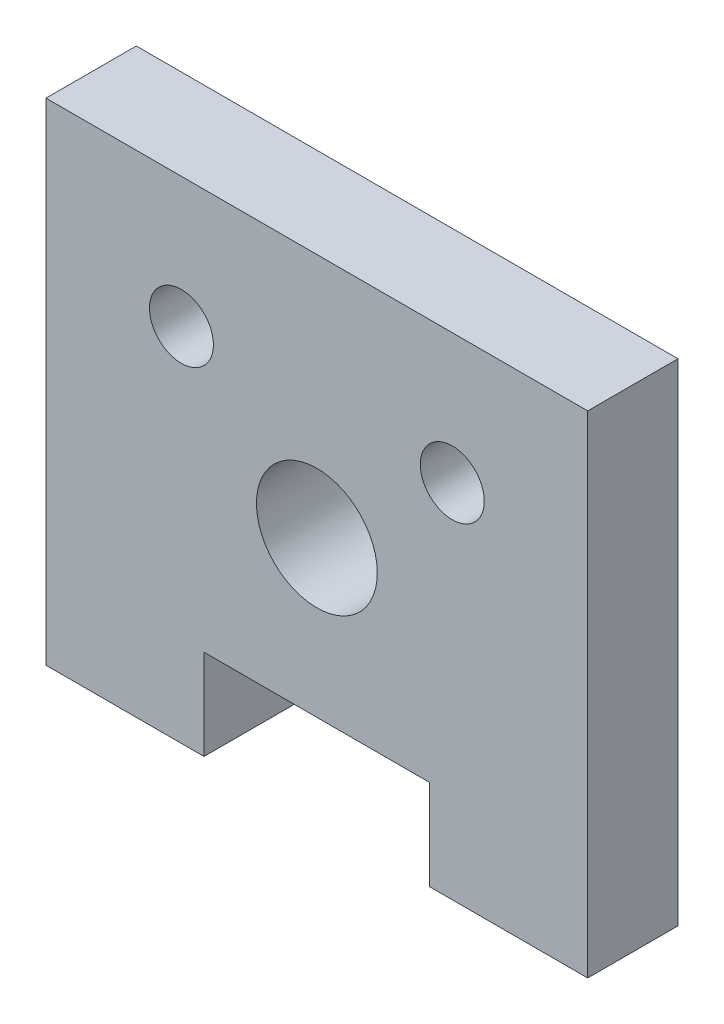
ISO-10303-21;
HEADER;
FILE_DESCRIPTION(('STEP AP214'),'2;1');
FILE_NAME('part.step','',(''),(''),'','','');
FILE_SCHEMA(('AUTOMOTIVE_DESIGN { 1 0 10303 214 1 1 1 1 }'));
ENDSEC;
DATA;
#1=APPLICATION_CONTEXT('core data for automotive mechanical design processes');
#2=APPLICATION_PROTOCOL_DEFINITION('international standard','automotive_design',2000,#1);
#3=PRODUCT_CONTEXT('',#1,'mechanical');
#4=PRODUCT('Part','Part','',(#3));
#5=PRODUCT_RELATED_PRODUCT_CATEGORY('part','',(#4));
#6=PRODUCT_DEFINITION_FORMATION('','',#4);
#7=PRODUCT_DEFINITION_CONTEXT('part definition',#1,'design');
#8=PRODUCT_DEFINITION('design','',#6,#7);
#9=PRODUCT_DEFINITION_SHAPE('','',#8);
#10=(LENGTH_UNIT() NAMED_UNIT(*) SI_UNIT(.MILLI.,.METRE.));
#11=(NAMED_UNIT(*) PLANE_ANGLE_UNIT() SI_UNIT($,.RADIAN.));
#12=(NAMED_UNIT(*) SI_UNIT($,.STERADIAN.) SOLID_ANGLE_UNIT());
#13=UNCERTAINTY_MEASURE_WITH_UNIT(LENGTH_MEASURE(1.E-05),#10,'distance_accuracy_value','');
#14=(GEOMETRIC_REPRESENTATION_CONTEXT(3) GLOBAL_UNCERTAINTY_ASSIGNED_CONTEXT((#13)) GLOBAL_UNIT_ASSIGNED_CONTEXT((#10,
#11,#12)) REPRESENTATION_CONTEXT('',''));
#15=CARTESIAN_POINT('',(0.,0.,0.));
#16=DIRECTION('',(0.,0.,1.));
#17=DIRECTION('',(1.,0.,0.));
#18=AXIS2_PLACEMENT_3D('',#15,#16,#17);
#19=CARTESIAN_POINT('',(0.,0.,12.7));
#20=DIRECTION('',(0.,0.,1.));
#21=DIRECTION('',(1.,0.,0.));
#22=AXIS2_PLACEMENT_3D('',#19,#20,#21);
#23=PLANE('',#22);
#24=CARTESIAN_POINT('',(19.05,16.256,12.7));
#25=DIRECTION('',(0.,0.,1.));
#26=DIRECTION('',(1.,0.,0.));
#27=AXIS2_PLACEMENT_3D('',#24,#25,#26);
#28=CIRCLE('',#27,4.5);
#29=CARTESIAN_POINT('',(23.55,16.256,12.7));
#30=VERTEX_POINT('',#29);
#31=EDGE_CURVE('E182',#30,#30,#28,.T.);
#32=ORIENTED_EDGE('',*,*,#31,.F.);
#33=EDGE_LOOP('',(#32));
#34=FACE_BOUND('',#33,.T.);
#35=DIRECTION('',(0.,-1.,0.));
#36=VECTOR('',#35,1.);
#37=CARTESIAN_POINT('',(-38.1,-34.544,12.7));
#38=LINE('',#37,#36);
#39=CARTESIAN_POINT('',(-38.1,34.544,12.7));
#40=VERTEX_POINT('',#39);
#41=CARTESIAN_POINT('',(-38.1,-34.544,12.7));
#42=VERTEX_POINT('',#41);
#43=EDGE_CURVE('E145',#40,#42,#38,.T.);
#44=ORIENTED_EDGE('',*,*,#43,.T.);
#45=DIRECTION('',(1.,0.,0.));
#46=VECTOR('',#45,1.);
#47=CARTESIAN_POINT('',(-15.875,-34.544,12.7));
#48=LINE('',#47,#46);
#49=CARTESIAN_POINT('',(-15.875,-34.544,12.7));
#50=VERTEX_POINT('',#49);
#51=EDGE_CURVE('E93',#42,#50,#48,.T.);
#52=ORIENTED_EDGE('',*,*,#51,.T.);
#53=DIRECTION('',(0.,1.,0.));
#54=VECTOR('',#53,1.);
#55=CARTESIAN_POINT('',(-15.875,-34.544,12.7));
#56=LINE('',#55,#54);
#57=CARTESIAN_POINT('',(-15.875,-21.844,12.7));
#58=VERTEX_POINT('',#57);
#59=EDGE_CURVE('E160',#50,#58,#56,.T.);
#60=ORIENTED_EDGE('',*,*,#59,.T.);
#61=DIRECTION('',(1.,0.,0.));
#62=VECTOR('',#61,1.);
#63=CARTESIAN_POINT('',(-15.875,-21.844,12.7));
#64=LINE('',#63,#62);
#65=CARTESIAN_POINT('',(15.875,-21.844,12.7));
#66=VERTEX_POINT('',#65);
#67=EDGE_CURVE('E173',#58,#66,#64,.T.);
#68=ORIENTED_EDGE('',*,*,#67,.T.);
#69=DIRECTION('',(0.,-1.,0.));
#70=VECTOR('',#69,1.);
#71=CARTESIAN_POINT('',(15.875,-21.844,12.7));
#72=LINE('',#71,#70);
#73=CARTESIAN_POINT('',(15.875,-34.544,12.7));
#74=VERTEX_POINT('',#73);
#75=EDGE_CURVE('E112',#66,#74,#72,.T.);
#76=ORIENTED_EDGE('',*,*,#75,.T.);
#77=DIRECTION('',(1.,0.,0.));
#78=VECTOR('',#77,1.);
#79=CARTESIAN_POINT('',(38.1,-34.544,12.7));
#80=LINE('',#79,#78);
#81=CARTESIAN_POINT('',(38.1,-34.544,12.7));
#82=VERTEX_POINT('',#81);
#83=EDGE_CURVE('E106',#74,#82,#80,.T.);
#84=ORIENTED_EDGE('',*,*,#83,.T.);
#85=DIRECTION('',(0.,1.,0.));
#86=VECTOR('',#85,1.);
#87=CARTESIAN_POINT('',(38.1,-34.544,12.7));
#88=LINE('',#87,#86);
#89=CARTESIAN_POINT('',(38.1,34.544,12.7));
#90=VERTEX_POINT('',#89);
#91=EDGE_CURVE('E110',#82,#90,#88,.T.);
#92=ORIENTED_EDGE('',*,*,#91,.T.);
#93=DIRECTION('',(-1.,0.,0.));
#94=VECTOR('',#93,1.);
#95=CARTESIAN_POINT('',(38.1,34.544,12.7));
#96=LINE('',#95,#94);
#97=EDGE_CURVE('E50',#90,#40,#96,.T.);
#98=ORIENTED_EDGE('',*,*,#97,.T.);
#99=EDGE_LOOP('',(#44,#52,#60,#68,#76,#84,#92,#98));
#100=FACE_BOUND('',#99,.T.);
#101=CARTESIAN_POINT('',(0.,0.,12.7));
#102=DIRECTION('',(0.,0.,1.));
#103=DIRECTION('',(1.,0.,0.));
#104=AXIS2_PLACEMENT_3D('',#101,#102,#103);
#105=CIRCLE('',#104,8.5);
#106=CARTESIAN_POINT('',(8.5,0.,12.7));
#107=VERTEX_POINT('',#106);
#108=EDGE_CURVE('E134',#107,#107,#105,.T.);
#109=ORIENTED_EDGE('',*,*,#108,.F.);
#110=EDGE_LOOP('',(#109));
#111=FACE_BOUND('',#110,.T.);
#112=CARTESIAN_POINT('',(-19.05,16.256,12.7));
#113=DIRECTION('',(0.,0.,1.));
#114=DIRECTION('',(1.,0.,0.));
#115=AXIS2_PLACEMENT_3D('',#112,#113,#114);
#116=CIRCLE('',#115,4.5);
#117=CARTESIAN_POINT('',(-14.55,16.256,12.7));
#118=VERTEX_POINT('',#117);
#119=EDGE_CURVE('E188',#118,#118,#116,.T.);
#120=ORIENTED_EDGE('',*,*,#119,.F.);
#121=EDGE_LOOP('',(#120));
#122=FACE_BOUND('',#121,.T.);
#123=ADVANCED_FACE('F33',(#34,#100,#111,#122),#23,.T.);
#124=CARTESIAN_POINT('',(0.,0.,0.));
#125=DIRECTION('',(0.,0.,1.));
#126=DIRECTION('',(1.,0.,0.));
#127=AXIS2_PLACEMENT_3D('',#124,#125,#126);
#128=PLANE('',#127);
#129=DIRECTION('',(0.,-1.,0.));
#130=VECTOR('',#129,1.);
#131=CARTESIAN_POINT('',(-38.1,-34.544,0.));
#132=LINE('',#131,#130);
#133=CARTESIAN_POINT('',(-38.1,34.544,0.));
#134=VERTEX_POINT('',#133);
#135=CARTESIAN_POINT('',(-38.1,-34.544,0.));
#136=VERTEX_POINT('',#135);
#137=EDGE_CURVE('E130',#134,#136,#132,.T.);
#138=ORIENTED_EDGE('',*,*,#137,.F.);
#139=DIRECTION('',(-1.,0.,0.));
#140=VECTOR('',#139,1.);
#141=CARTESIAN_POINT('',(38.1,34.544,0.));
#142=LINE('',#141,#140);
#143=CARTESIAN_POINT('',(38.1,34.544,0.));
#144=VERTEX_POINT('',#143);
#145=EDGE_CURVE('E85',#144,#134,#142,.T.);
#146=ORIENTED_EDGE('',*,*,#145,.F.);
#147=DIRECTION('',(0.,1.,0.));
#148=VECTOR('',#147,1.);
#149=CARTESIAN_POINT('',(38.1,-34.544,0.));
#150=LINE('',#149,#148);
#151=CARTESIAN_POINT('',(38.1,-34.544,0.));
#152=VERTEX_POINT('',#151);
#153=EDGE_CURVE('E79',#152,#144,#150,.T.);
#154=ORIENTED_EDGE('',*,*,#153,.F.);
#155=DIRECTION('',(1.,0.,0.));
#156=VECTOR('',#155,1.);
#157=CARTESIAN_POINT('',(38.1,-34.544,0.));
#158=LINE('',#157,#156);
#159=CARTESIAN_POINT('',(15.875,-34.544,0.));
#160=VERTEX_POINT('',#159);
#161=EDGE_CURVE('E120',#160,#152,#158,.T.);
#162=ORIENTED_EDGE('',*,*,#161,.F.);
#163=DIRECTION('',(0.,-1.,0.));
#164=VECTOR('',#163,1.);
#165=CARTESIAN_POINT('',(15.875,-21.844,0.));
#166=LINE('',#165,#164);
#167=CARTESIAN_POINT('',(15.875,-21.844,0.));
#168=VERTEX_POINT('',#167);
#169=EDGE_CURVE('E140',#168,#160,#166,.T.);
#170=ORIENTED_EDGE('',*,*,#169,.F.);
#171=DIRECTION('',(1.,0.,0.));
#172=VECTOR('',#171,1.);
#173=CARTESIAN_POINT('',(-15.875,-21.844,0.));
#174=LINE('',#173,#172);
#175=CARTESIAN_POINT('',(-15.875,-21.844,0.));
#176=VERTEX_POINT('',#175);
#177=EDGE_CURVE('E138',#176,#168,#174,.T.);
#178=ORIENTED_EDGE('',*,*,#177,.F.);
#179=DIRECTION('',(0.,1.,0.));
#180=VECTOR('',#179,1.);
#181=CARTESIAN_POINT('',(-15.875,-34.544,0.));
#182=LINE('',#181,#180);
#183=CARTESIAN_POINT('',(-15.875,-34.544,0.));
#184=VERTEX_POINT('',#183);
#185=EDGE_CURVE('E136',#184,#176,#182,.T.);
#186=ORIENTED_EDGE('',*,*,#185,.F.);
#187=DIRECTION('',(1.,0.,0.));
#188=VECTOR('',#187,1.);
#189=CARTESIAN_POINT('',(-15.875,-34.544,0.));
#190=LINE('',#189,#188);
#191=EDGE_CURVE('E133',#136,#184,#190,.T.);
#192=ORIENTED_EDGE('',*,*,#191,.F.);
#193=EDGE_LOOP('',(#138,#146,#154,#162,#170,#178,#186,#192));
#194=FACE_BOUND('',#193,.T.);
#195=CARTESIAN_POINT('',(0.,0.,0.));
#196=DIRECTION('',(0.,0.,1.));
#197=DIRECTION('',(1.,0.,0.));
#198=AXIS2_PLACEMENT_3D('',#195,#196,#197);
#199=CIRCLE('',#198,8.5);
#200=CARTESIAN_POINT('',(8.5,0.,0.));
#201=VERTEX_POINT('',#200);
#202=EDGE_CURVE('E179',#201,#201,#199,.T.);
#203=ORIENTED_EDGE('',*,*,#202,.T.);
#204=EDGE_LOOP('',(#203));
#205=FACE_BOUND('',#204,.T.);
#206=CARTESIAN_POINT('',(19.05,16.256,0.));
#207=DIRECTION('',(0.,0.,1.));
#208=DIRECTION('',(1.,0.,0.));
#209=AXIS2_PLACEMENT_3D('',#206,#207,#208);
#210=CIRCLE('',#209,4.5);
#211=CARTESIAN_POINT('',(23.55,16.256,0.));
#212=VERTEX_POINT('',#211);
#213=EDGE_CURVE('E185',#212,#212,#210,.T.);
#214=ORIENTED_EDGE('',*,*,#213,.T.);
#215=EDGE_LOOP('',(#214));
#216=FACE_BOUND('',#215,.T.);
#217=CARTESIAN_POINT('',(-19.05,16.256,0.));
#218=DIRECTION('',(0.,0.,1.));
#219=DIRECTION('',(1.,0.,0.));
#220=AXIS2_PLACEMENT_3D('',#217,#218,#219);
#221=CIRCLE('',#220,4.5);
#222=CARTESIAN_POINT('',(-14.55,16.256,0.));
#223=VERTEX_POINT('',#222);
#224=EDGE_CURVE('E191',#223,#223,#221,.T.);
#225=ORIENTED_EDGE('',*,*,#224,.T.);
#226=EDGE_LOOP('',(#225));
#227=FACE_BOUND('',#226,.T.);
#228=ADVANCED_FACE('F164',(#194,#205,#216,#227),#128,.F.);
#229=CARTESIAN_POINT('',(-38.1,-34.544,12.7));
#230=DIRECTION('',(1.,0.,0.));
#231=DIRECTION('',(0.,0.,-1.));
#232=AXIS2_PLACEMENT_3D('',#229,#230,#231);
#233=PLANE('',#232);
#234=ORIENTED_EDGE('',*,*,#137,.T.);
#235=DIRECTION('',(0.,0.,-1.));
#236=VECTOR('',#235,1.);
#237=CARTESIAN_POINT('',(-38.1,-34.544,12.7));
#238=LINE('',#237,#236);
#239=EDGE_CURVE('E11',#42,#136,#238,.T.);
#240=ORIENTED_EDGE('',*,*,#239,.F.);
#241=ORIENTED_EDGE('',*,*,#43,.F.);
#242=DIRECTION('',(0.,0.,-1.));
#243=VECTOR('',#242,1.);
#244=CARTESIAN_POINT('',(-38.1,34.544,12.7));
#245=LINE('',#244,#243);
#246=EDGE_CURVE('E126',#40,#134,#245,.T.);
#247=ORIENTED_EDGE('',*,*,#246,.T.);
#248=EDGE_LOOP('',(#234,#240,#241,#247));
#249=FACE_BOUND('',#248,.T.);
#250=ADVANCED_FACE('F35',(#249),#233,.F.);
#251=CARTESIAN_POINT('',(-15.875,-34.544,12.7));
#252=DIRECTION('',(0.,1.,0.));
#253=DIRECTION('',(0.,0.,1.));
#254=AXIS2_PLACEMENT_3D('',#251,#252,#253);
#255=PLANE('',#254);
#256=ORIENTED_EDGE('',*,*,#191,.T.);
#257=DIRECTION('',(0.,0.,-1.));
#258=VECTOR('',#257,1.);
#259=CARTESIAN_POINT('',(-15.875,-34.544,12.7));
#260=LINE('',#259,#258);
#261=EDGE_CURVE('E42',#50,#184,#260,.T.);
#262=ORIENTED_EDGE('',*,*,#261,.F.);
#263=ORIENTED_EDGE('',*,*,#51,.F.);
#264=ORIENTED_EDGE('',*,*,#239,.T.);
#265=EDGE_LOOP('',(#256,#262,#263,#264));
#266=FACE_BOUND('',#265,.T.);
#267=ADVANCED_FACE('F224',(#266),#255,.F.);
#268=CARTESIAN_POINT('',(-15.875,-34.544,12.7));
#269=DIRECTION('',(-1.,0.,0.));
#270=DIRECTION('',(0.,0.,1.));
#271=AXIS2_PLACEMENT_3D('',#268,#269,#270);
#272=PLANE('',#271);
#273=ORIENTED_EDGE('',*,*,#185,.T.);
#274=DIRECTION('',(0.,0.,-1.));
#275=VECTOR('',#274,1.);
#276=CARTESIAN_POINT('',(-15.875,-21.844,12.7));
#277=LINE('',#276,#275);
#278=EDGE_CURVE('E152',#58,#176,#277,.T.);
#279=ORIENTED_EDGE('',*,*,#278,.F.);
#280=ORIENTED_EDGE('',*,*,#59,.F.);
#281=ORIENTED_EDGE('',*,*,#261,.T.);
#282=EDGE_LOOP('',(#273,#279,#280,#281));
#283=FACE_BOUND('',#282,.T.);
#284=ADVANCED_FACE('F158',(#283),#272,.F.);
#285=CARTESIAN_POINT('',(-15.875,-21.844,12.7));
#286=DIRECTION('',(0.,1.,0.));
#287=DIRECTION('',(-1.,0.,0.));
#288=AXIS2_PLACEMENT_3D('',#285,#286,#287);
#289=PLANE('',#288);
#290=ORIENTED_EDGE('',*,*,#177,.T.);
#291=DIRECTION('',(0.,0.,-1.));
#292=VECTOR('',#291,1.);
#293=CARTESIAN_POINT('',(15.875,-21.844,12.7));
#294=LINE('',#293,#292);
#295=EDGE_CURVE('E149',#66,#168,#294,.T.);
#296=ORIENTED_EDGE('',*,*,#295,.F.);
#297=ORIENTED_EDGE('',*,*,#67,.F.);
#298=ORIENTED_EDGE('',*,*,#278,.T.);
#299=EDGE_LOOP('',(#290,#296,#297,#298));
#300=FACE_BOUND('',#299,.T.);
#301=ADVANCED_FACE('F169',(#300),#289,.F.);
#302=CARTESIAN_POINT('',(15.875,-21.844,12.7));
#303=DIRECTION('',(1.,0.,0.));
#304=DIRECTION('',(0.,0.,-1.));
#305=AXIS2_PLACEMENT_3D('',#302,#303,#304);
#306=PLANE('',#305);
#307=ORIENTED_EDGE('',*,*,#169,.T.);
#308=DIRECTION('',(0.,0.,-1.));
#309=VECTOR('',#308,1.);
#310=CARTESIAN_POINT('',(15.875,-34.544,12.7));
#311=LINE('',#310,#309);
#312=EDGE_CURVE('E121',#74,#160,#311,.T.);
#313=ORIENTED_EDGE('',*,*,#312,.F.);
#314=ORIENTED_EDGE('',*,*,#75,.F.);
#315=ORIENTED_EDGE('',*,*,#295,.T.);
#316=EDGE_LOOP('',(#307,#313,#314,#315));
#317=FACE_BOUND('',#316,.T.);
#318=ADVANCED_FACE('F172',(#317),#306,.F.);
#319=CARTESIAN_POINT('',(38.1,-34.544,12.7));
#320=DIRECTION('',(0.,1.,0.));
#321=DIRECTION('',(0.,0.,1.));
#322=AXIS2_PLACEMENT_3D('',#319,#320,#321);
#323=PLANE('',#322);
#324=ORIENTED_EDGE('',*,*,#161,.T.);
#325=DIRECTION('',(0.,0.,-1.));
#326=VECTOR('',#325,1.);
#327=CARTESIAN_POINT('',(38.1,-34.544,12.7));
#328=LINE('',#327,#326);
#329=EDGE_CURVE('E117',#82,#152,#328,.T.);
#330=ORIENTED_EDGE('',*,*,#329,.F.);
#331=ORIENTED_EDGE('',*,*,#83,.F.);
#332=ORIENTED_EDGE('',*,*,#312,.T.);
#333=EDGE_LOOP('',(#324,#330,#331,#332));
#334=FACE_BOUND('',#333,.T.);
#335=ADVANCED_FACE('F118',(#334),#323,.F.);
#336=CARTESIAN_POINT('',(38.1,-34.544,12.7));
#337=DIRECTION('',(-1.,0.,0.));
#338=DIRECTION('',(0.,0.,1.));
#339=AXIS2_PLACEMENT_3D('',#336,#337,#338);
#340=PLANE('',#339);
#341=ORIENTED_EDGE('',*,*,#153,.T.);
#342=DIRECTION('',(0.,0.,-1.));
#343=VECTOR('',#342,1.);
#344=CARTESIAN_POINT('',(38.1,34.544,12.7));
#345=LINE('',#344,#343);
#346=EDGE_CURVE('E122',#90,#144,#345,.T.);
#347=ORIENTED_EDGE('',*,*,#346,.F.);
#348=ORIENTED_EDGE('',*,*,#91,.F.);
#349=ORIENTED_EDGE('',*,*,#329,.T.);
#350=EDGE_LOOP('',(#341,#347,#348,#349));
#351=FACE_BOUND('',#350,.T.);
#352=ADVANCED_FACE('F124',(#351),#340,.F.);
#353=CARTESIAN_POINT('',(38.1,34.544,12.7));
#354=DIRECTION('',(0.,-1.,0.));
#355=DIRECTION('',(0.,0.,-1.));
#356=AXIS2_PLACEMENT_3D('',#353,#354,#355);
#357=PLANE('',#356);
#358=ORIENTED_EDGE('',*,*,#145,.T.);
#359=ORIENTED_EDGE('',*,*,#246,.F.);
#360=ORIENTED_EDGE('',*,*,#97,.F.);
#361=ORIENTED_EDGE('',*,*,#346,.T.);
#362=EDGE_LOOP('',(#358,#359,#360,#361));
#363=FACE_BOUND('',#362,.T.);
#364=ADVANCED_FACE('F212',(#363),#357,.F.);
#365=CARTESIAN_POINT('',(0.,0.,12.7));
#366=DIRECTION('',(0.,0.,-1.));
#367=DIRECTION('',(-1.,0.,0.));
#368=AXIS2_PLACEMENT_3D('',#365,#366,#367);
#369=CYLINDRICAL_SURFACE('',#368,8.5);
#370=ORIENTED_EDGE('',*,*,#108,.T.);
#371=EDGE_LOOP('',(#370));
#372=FACE_BOUND('',#371,.T.);
#373=ORIENTED_EDGE('',*,*,#202,.F.);
#374=EDGE_LOOP('',(#373));
#375=FACE_BOUND('',#374,.T.);
#376=ADVANCED_FACE('F209',(#372,#375),#369,.F.);
#377=CARTESIAN_POINT('',(19.05,16.256,12.7));
#378=DIRECTION('',(0.,0.,-1.));
#379=DIRECTION('',(-1.,0.,0.));
#380=AXIS2_PLACEMENT_3D('',#377,#378,#379);
#381=CYLINDRICAL_SURFACE('',#380,4.5);
#382=ORIENTED_EDGE('',*,*,#31,.T.);
#383=EDGE_LOOP('',(#382));
#384=FACE_BOUND('',#383,.T.);
#385=ORIENTED_EDGE('',*,*,#213,.F.);
#386=EDGE_LOOP('',(#385));
#387=FACE_BOUND('',#386,.T.);
#388=ADVANCED_FACE('F288',(#384,#387),#381,.F.);
#389=CARTESIAN_POINT('',(-19.05,16.256,12.7));
#390=DIRECTION('',(0.,0.,-1.));
#391=DIRECTION('',(-1.,0.,0.));
#392=AXIS2_PLACEMENT_3D('',#389,#390,#391);
#393=CYLINDRICAL_SURFACE('',#392,4.5);
#394=ORIENTED_EDGE('',*,*,#119,.T.);
#395=EDGE_LOOP('',(#394));
#396=FACE_BOUND('',#395,.T.);
#397=ORIENTED_EDGE('',*,*,#224,.F.);
#398=EDGE_LOOP('',(#397));
#399=FACE_BOUND('',#398,.T.);
#400=ADVANCED_FACE('F197',(#396,#399),#393,.F.);
#401=CLOSED_SHELL('',(#123,#228,#250,#267,#284,#301,#318,#335,#352,#364,#376,#388,#400));
#402=MANIFOLD_SOLID_BREP('B2',#401);
#403=ADVANCED_BREP_SHAPE_REPRESENTATION('',(#18,#402),#14);
#404=SHAPE_DEFINITION_REPRESENTATION(#9,#403);
ENDSEC;
END-ISO-10303-21;
